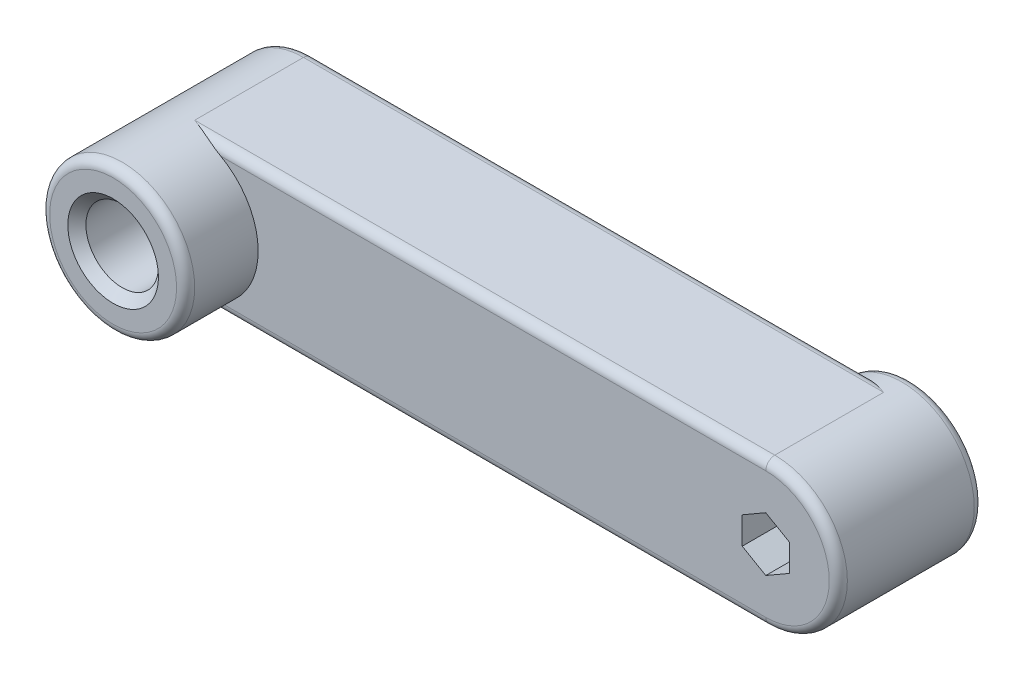
ISO-10303-21;
HEADER;
FILE_DESCRIPTION(('STEP AP214'),'2;1');
FILE_NAME('part.step','',(''),(''),'','','');
FILE_SCHEMA(('AUTOMOTIVE_DESIGN { 1 0 10303 214 1 1 1 1 }'));
ENDSEC;
DATA;
#1=APPLICATION_CONTEXT('core data for automotive mechanical design processes');
#2=APPLICATION_PROTOCOL_DEFINITION('international standard','automotive_design',2000,#1);
#3=PRODUCT_CONTEXT('',#1,'mechanical');
#4=PRODUCT('Part','Part','',(#3));
#5=PRODUCT_RELATED_PRODUCT_CATEGORY('part','',(#4));
#6=PRODUCT_DEFINITION_FORMATION('','',#4);
#7=PRODUCT_DEFINITION_CONTEXT('part definition',#1,'design');
#8=PRODUCT_DEFINITION('design','',#6,#7);
#9=PRODUCT_DEFINITION_SHAPE('','',#8);
#10=(LENGTH_UNIT() NAMED_UNIT(*) SI_UNIT(.MILLI.,.METRE.));
#11=(NAMED_UNIT(*) PLANE_ANGLE_UNIT() SI_UNIT($,.RADIAN.));
#12=(NAMED_UNIT(*) SI_UNIT($,.STERADIAN.) SOLID_ANGLE_UNIT());
#13=UNCERTAINTY_MEASURE_WITH_UNIT(LENGTH_MEASURE(1.E-05),#10,'distance_accuracy_value','');
#14=(GEOMETRIC_REPRESENTATION_CONTEXT(3) GLOBAL_UNCERTAINTY_ASSIGNED_CONTEXT((#13)) GLOBAL_UNIT_ASSIGNED_CONTEXT((#10,
#11,#12)) REPRESENTATION_CONTEXT('',''));
#15=CARTESIAN_POINT('',(0.,0.,0.));
#16=DIRECTION('',(0.,0.,1.));
#17=DIRECTION('',(1.,0.,0.));
#18=AXIS2_PLACEMENT_3D('',#15,#16,#17);
#19=CARTESIAN_POINT('',(0.,4.,12.));
#20=DIRECTION('',(0.,-1.,0.));
#21=DIRECTION('',(1.,0.,0.));
#22=AXIS2_PLACEMENT_3D('',#19,#20,#21);
#23=PLANE('',#22);
#24=DIRECTION('',(0.,0.,-1.));
#25=VECTOR('',#24,1.);
#26=CARTESIAN_POINT('',(-32.,4.,12.));
#27=LINE('',#26,#25);
#28=CARTESIAN_POINT('',(-32.,4.,7.5));
#29=VERTEX_POINT('',#28);
#30=CARTESIAN_POINT('',(-32.,4.,1.5));
#31=VERTEX_POINT('',#30);
#32=EDGE_CURVE('E183',#29,#31,#27,.T.);
#33=ORIENTED_EDGE('',*,*,#32,.F.);
#34=DIRECTION('',(-1.,0.,0.));
#35=VECTOR('',#34,1.);
#36=CARTESIAN_POINT('',(0.,4.,7.5));
#37=LINE('',#36,#35);
#38=CARTESIAN_POINT('',(0.,4.,7.5));
#39=VERTEX_POINT('',#38);
#40=EDGE_CURVE('E195',#29,#39,#37,.F.);
#41=ORIENTED_EDGE('',*,*,#40,.T.);
#42=DIRECTION('',(0.,0.,-1.));
#43=VECTOR('',#42,1.);
#44=CARTESIAN_POINT('',(0.,4.,12.));
#45=LINE('',#44,#43);
#46=CARTESIAN_POINT('',(0.,4.,1.5));
#47=VERTEX_POINT('',#46);
#48=EDGE_CURVE('E150',#39,#47,#45,.T.);
#49=ORIENTED_EDGE('',*,*,#48,.T.);
#50=DIRECTION('',(1.,0.,0.));
#51=VECTOR('',#50,1.);
#52=CARTESIAN_POINT('',(-32.,4.,1.5));
#53=LINE('',#52,#51);
#54=EDGE_CURVE('E193',#47,#31,#53,.F.);
#55=ORIENTED_EDGE('',*,*,#54,.T.);
#56=EDGE_LOOP('',(#33,#41,#49,#55));
#57=FACE_BOUND('',#56,.T.);
#58=ADVANCED_FACE('F36',(#57),#23,.F.);
#59=CARTESIAN_POINT('',(0.,-4.,12.));
#60=DIRECTION('',(0.,1.,0.));
#61=DIRECTION('',(-1.,0.,0.));
#62=AXIS2_PLACEMENT_3D('',#59,#60,#61);
#63=PLANE('',#62);
#64=DIRECTION('',(0.,0.,-1.));
#65=VECTOR('',#64,1.);
#66=CARTESIAN_POINT('',(-32.,-4.,12.));
#67=LINE('',#66,#65);
#68=CARTESIAN_POINT('',(-32.,-4.,7.5));
#69=VERTEX_POINT('',#68);
#70=CARTESIAN_POINT('',(-32.,-4.,1.5));
#71=VERTEX_POINT('',#70);
#72=EDGE_CURVE('E181',#69,#71,#67,.T.);
#73=ORIENTED_EDGE('',*,*,#72,.T.);
#74=DIRECTION('',(-1.,0.,0.));
#75=VECTOR('',#74,1.);
#76=CARTESIAN_POINT('',(0.,-4.,1.5));
#77=LINE('',#76,#75);
#78=CARTESIAN_POINT('',(0.,-4.,1.5));
#79=VERTEX_POINT('',#78);
#80=EDGE_CURVE('E210',#71,#79,#77,.F.);
#81=ORIENTED_EDGE('',*,*,#80,.T.);
#82=DIRECTION('',(0.,0.,-1.));
#83=VECTOR('',#82,1.);
#84=CARTESIAN_POINT('',(0.,-4.,12.));
#85=LINE('',#84,#83);
#86=CARTESIAN_POINT('',(0.,-4.,7.5));
#87=VERTEX_POINT('',#86);
#88=EDGE_CURVE('E178',#87,#79,#85,.T.);
#89=ORIENTED_EDGE('',*,*,#88,.F.);
#90=DIRECTION('',(1.,0.,0.));
#91=VECTOR('',#90,1.);
#92=CARTESIAN_POINT('',(-32.,-4.,7.5));
#93=LINE('',#92,#91);
#94=EDGE_CURVE('E58',#87,#69,#93,.F.);
#95=ORIENTED_EDGE('',*,*,#94,.T.);
#96=EDGE_LOOP('',(#73,#81,#89,#95));
#97=FACE_BOUND('',#96,.T.);
#98=ADVANCED_FACE('F295',(#97),#63,.F.);
#99=CARTESIAN_POINT('',(0.,0.,12.));
#100=DIRECTION('',(0.,0.,1.));
#101=DIRECTION('',(1.,0.,0.));
#102=AXIS2_PLACEMENT_3D('',#99,#100,#101);
#103=PLANE('',#102);
#104=CARTESIAN_POINT('',(-32.,0.,12.));
#105=DIRECTION('',(0.,0.,1.));
#106=DIRECTION('',(1.,0.,0.));
#107=AXIS2_PLACEMENT_3D('',#104,#105,#106);
#108=CIRCLE('',#107,2.5);
#109=CARTESIAN_POINT('',(-29.5,0.,12.));
#110=VERTEX_POINT('',#109);
#111=EDGE_CURVE('E12',#110,#110,#108,.F.);
#112=ORIENTED_EDGE('',*,*,#111,.T.);
#113=EDGE_LOOP('',(#112));
#114=FACE_BOUND('',#113,.T.);
#115=CARTESIAN_POINT('',(-32.,0.,12.));
#116=DIRECTION('',(0.,0.,1.));
#117=DIRECTION('',(1.,0.,0.));
#118=AXIS2_PLACEMENT_3D('',#115,#116,#117);
#119=CIRCLE('',#118,3.5);
#120=CARTESIAN_POINT('',(-28.5,0.,12.));
#121=VERTEX_POINT('',#120);
#122=EDGE_CURVE('E216',#121,#121,#119,.T.);
#123=ORIENTED_EDGE('',*,*,#122,.T.);
#124=EDGE_LOOP('',(#123));
#125=FACE_BOUND('',#124,.T.);
#126=ADVANCED_FACE('F300',(#114,#125),#103,.T.);
#127=CARTESIAN_POINT('',(0.,0.,12.));
#128=DIRECTION('',(0.,0.,-1.));
#129=DIRECTION('',(-1.,0.,0.));
#130=AXIS2_PLACEMENT_3D('',#127,#128,#129);
#131=CYLINDRICAL_SURFACE('',#130,4.);
#132=CARTESIAN_POINT('',(0.,0.,0.5));
#133=DIRECTION('',(0.,0.,1.));
#134=DIRECTION('',(1.,0.,0.));
#135=AXIS2_PLACEMENT_3D('',#132,#133,#134);
#136=CIRCLE('',#135,4.);
#137=CARTESIAN_POINT('',(4.,0.,0.5));
#138=VERTEX_POINT('',#137);
#139=EDGE_CURVE('E197',#138,#138,#136,.T.);
#140=ORIENTED_EDGE('',*,*,#139,.T.);
#141=EDGE_LOOP('',(#140));
#142=FACE_BOUND('',#141,.T.);
#143=ORIENTED_EDGE('',*,*,#48,.F.);
#144=CARTESIAN_POINT('',(0.,0.,7.5));
#145=DIRECTION('',(0.,0.,1.));
#146=DIRECTION('',(1.,0.,0.));
#147=AXIS2_PLACEMENT_3D('',#144,#145,#146);
#148=CIRCLE('',#147,4.);
#149=EDGE_CURVE('E200',#39,#87,#148,.F.);
#150=ORIENTED_EDGE('',*,*,#149,.T.);
#151=ORIENTED_EDGE('',*,*,#88,.T.);
#152=CARTESIAN_POINT('',(-1.93649167310371,-3.5,1.));
#153=CARTESIAN_POINT('',(-1.90753028034818,-3.51602452890695,1.0000045242322));
#154=CARTESIAN_POINT('',(-1.87837895571592,-3.5316832268583,1.0007697313531));
#155=CARTESIAN_POINT('',(-1.81976143534284,-3.56224076830084,1.00365089838944));
#156=CARTESIAN_POINT('',(-1.79029538129305,-3.57713993762364,1.00576627373734));
#157=CARTESIAN_POINT('',(-1.70161882700781,-3.62061046682219,1.01387079607546));
#158=CARTESIAN_POINT('',(-1.64199827129799,-3.64802762012,1.02161991362533));
#159=CARTESIAN_POINT('',(-1.52228181974889,-3.69957957997044,1.04073982798461));
#160=CARTESIAN_POINT('',(-1.46218931757453,-3.72372874338325,1.05209399816124));
#161=CARTESIAN_POINT('',(-1.3414130286532,-3.76892191495083,1.07767883129601));
#162=CARTESIAN_POINT('',(-1.28072883874712,-3.78996362134686,1.09191160819161));
#163=CARTESIAN_POINT('',(-1.12047898128076,-3.84127671374755,1.13234166806097));
#164=CARTESIAN_POINT('',(-1.02055733809324,-3.8689866165185,1.16041904642806));
#165=CARTESIAN_POINT('',(-0.820058124313303,-3.91639293315178,1.22056644294997));
#166=CARTESIAN_POINT('',(-0.719480299860172,-3.93608603262952,1.25263810531898));
#167=CARTESIAN_POINT('',(-0.416975407891933,-3.9834384859329,1.35260227977867));
#168=CARTESIAN_POINT('',(-0.214250558586284,-3.99937929482843,1.42425146016427));
#169=CARTESIAN_POINT('',(-0.00795031262449099,-3.99999406881035,1.49718916392494));
#170=CARTESIAN_POINT('',(-0.00397507354767996,-3.99999999403084,1.49859462398704));
#171=CARTESIAN_POINT('',(0.,-4.,1.5));
#172=B_SPLINE_CURVE_WITH_KNOTS('',3,(#152,#153,#154,#155,#156,#157,#158,#159,#160,#161,#162,
#163,#164,#165,#166,#167,#168,#169,#170,#171),.UNSPECIFIED.,.F.,.F.,(4,2,2,2,2,2,2,2,2,4),(0.,
0.0992685761729138,0.198494202244431,0.396495797958421,0.593597153212507,0.790843781091407,
1.11263751267447,1.43456414856119,2.07833236296142,2.09098148611784),.UNSPECIFIED.);
#173=CARTESIAN_POINT('',(-1.93649167310371,-3.5,1.));
#174=VERTEX_POINT('',#173);
#175=EDGE_CURVE('E229',#79,#174,#172,.F.);
#176=ORIENTED_EDGE('',*,*,#175,.T.);
#177=CARTESIAN_POINT('',(0.,0.,1.));
#178=DIRECTION('',(0.,0.,-1.));
#179=DIRECTION('',(-1.,0.,0.));
#180=AXIS2_PLACEMENT_3D('',#177,#178,#179);
#181=CIRCLE('',#180,4.);
#182=CARTESIAN_POINT('',(-1.93649167310371,3.5,1.));
#183=VERTEX_POINT('',#182);
#184=EDGE_CURVE('E334',#174,#183,#181,.T.);
#185=ORIENTED_EDGE('',*,*,#184,.T.);
#186=CARTESIAN_POINT('',(-1.93649167310371,3.5,1.));
#187=CARTESIAN_POINT('',(-1.90753028034818,3.51602452890695,1.0000045242322));
#188=CARTESIAN_POINT('',(-1.87837895571592,3.5316832268583,1.0007697313531));
#189=CARTESIAN_POINT('',(-1.81976143534284,3.56224076830083,1.00365089838944));
#190=CARTESIAN_POINT('',(-1.79029538129306,3.57713993762363,1.00576627373734));
#191=CARTESIAN_POINT('',(-1.70161882700781,3.62061046682219,1.01387079607546));
#192=CARTESIAN_POINT('',(-1.641998271298,3.64802762012,1.02161991362533));
#193=CARTESIAN_POINT('',(-1.52228181974889,3.69957957997044,1.04073982798461));
#194=CARTESIAN_POINT('',(-1.46218931757453,3.72372874338325,1.05209399816124));
#195=CARTESIAN_POINT('',(-1.3414130286532,3.76892191495083,1.07767883129601));
#196=CARTESIAN_POINT('',(-1.28072883874712,3.78996362134686,1.09191160819161));
#197=CARTESIAN_POINT('',(-1.12047898128076,3.84127671374755,1.13234166806097));
#198=CARTESIAN_POINT('',(-1.02055733809325,3.8689866165185,1.16041904642806));
#199=CARTESIAN_POINT('',(-0.820058124313303,3.91639293315178,1.22056644294997));
#200=CARTESIAN_POINT('',(-0.719480299860173,3.93608603262952,1.25263810531898));
#201=CARTESIAN_POINT('',(-0.416975407891933,3.9834384859329,1.35260227977867));
#202=CARTESIAN_POINT('',(-0.214250558586282,3.99937929482843,1.42425146016426));
#203=CARTESIAN_POINT('',(-0.00795031262449036,3.99999406881035,1.49718916392494));
#204=CARTESIAN_POINT('',(-0.00397507354767965,3.99999999403084,1.49859462398704));
#205=CARTESIAN_POINT('',(0.,4.,1.5));
#206=B_SPLINE_CURVE_WITH_KNOTS('',3,(#186,#187,#188,#189,#190,#191,#192,#193,#194,#195,#196,
#197,#198,#199,#200,#201,#202,#203,#204,#205),.UNSPECIFIED.,.F.,.F.,(4,2,2,2,2,2,2,2,2,4),(0.,
0.0992685761729134,0.19849420224443,0.39649579795842,0.593597153212507,0.790843781091407,
1.11263751267447,1.4345641485612,2.07833236296142,2.09098148611784),.UNSPECIFIED.);
#207=EDGE_CURVE('E264',#183,#47,#206,.T.);
#208=ORIENTED_EDGE('',*,*,#207,.T.);
#209=EDGE_LOOP('',(#143,#150,#151,#176,#185,#208));
#210=FACE_BOUND('',#209,.T.);
#211=ADVANCED_FACE('F247',(#142,#210),#131,.T.);
#212=CARTESIAN_POINT('',(1.29905,0.750006867190784,12.));
#213=DIRECTION('',(-0.5,-0.866025403784439,0.));
#214=DIRECTION('',(0.866025403784439,-0.5,0.));
#215=AXIS2_PLACEMENT_3D('',#212,#213,#214);
#216=PLANE('',#215);
#217=DIRECTION('',(0.,0.,-1.));
#218=VECTOR('',#217,1.);
#219=CARTESIAN_POINT('',(1.29905,0.750006867190784,12.));
#220=LINE('',#219,#218);
#221=CARTESIAN_POINT('',(1.29905,0.750006867190784,8.));
#222=VERTEX_POINT('',#221);
#223=CARTESIAN_POINT('',(1.29905,0.750006867190784,0.));
#224=VERTEX_POINT('',#223);
#225=EDGE_CURVE('E166',#222,#224,#220,.T.);
#226=ORIENTED_EDGE('',*,*,#225,.F.);
#227=DIRECTION('',(-0.866025403784439,0.5,0.));
#228=VECTOR('',#227,1.);
#229=CARTESIAN_POINT('',(1.29905,0.750006867190784,8.));
#230=LINE('',#229,#228);
#231=CARTESIAN_POINT('',(0.,1.50001373438157,8.));
#232=VERTEX_POINT('',#231);
#233=EDGE_CURVE('E145',#222,#232,#230,.T.);
#234=ORIENTED_EDGE('',*,*,#233,.T.);
#235=DIRECTION('',(0.,0.,-1.));
#236=VECTOR('',#235,1.);
#237=CARTESIAN_POINT('',(0.,1.50001373438157,12.));
#238=LINE('',#237,#236);
#239=CARTESIAN_POINT('',(0.,1.50001373438157,0.));
#240=VERTEX_POINT('',#239);
#241=EDGE_CURVE('E176',#232,#240,#238,.T.);
#242=ORIENTED_EDGE('',*,*,#241,.T.);
#243=DIRECTION('',(-0.866025403784439,0.5,0.));
#244=VECTOR('',#243,1.);
#245=CARTESIAN_POINT('',(1.29905,0.750006867190784,0.));
#246=LINE('',#245,#244);
#247=EDGE_CURVE('E339',#224,#240,#246,.T.);
#248=ORIENTED_EDGE('',*,*,#247,.F.);
#249=EDGE_LOOP('',(#226,#234,#242,#248));
#250=FACE_BOUND('',#249,.T.);
#251=ADVANCED_FACE('F388',(#250),#216,.T.);
#252=CARTESIAN_POINT('',(0.,1.50001373438157,12.));
#253=DIRECTION('',(0.5,-0.866025403784439,0.));
#254=DIRECTION('',(0.866025403784439,0.5,0.));
#255=AXIS2_PLACEMENT_3D('',#252,#253,#254);
#256=PLANE('',#255);
#257=ORIENTED_EDGE('',*,*,#241,.F.);
#258=DIRECTION('',(-0.866025403784439,-0.5,0.));
#259=VECTOR('',#258,1.);
#260=CARTESIAN_POINT('',(0.,1.50001373438157,8.));
#261=LINE('',#260,#259);
#262=CARTESIAN_POINT('',(-1.29905,0.750006867190784,8.));
#263=VERTEX_POINT('',#262);
#264=EDGE_CURVE('E356',#232,#263,#261,.T.);
#265=ORIENTED_EDGE('',*,*,#264,.T.);
#266=DIRECTION('',(0.,0.,-1.));
#267=VECTOR('',#266,1.);
#268=CARTESIAN_POINT('',(-1.29905,0.750006867190784,12.));
#269=LINE('',#268,#267);
#270=CARTESIAN_POINT('',(-1.29905,0.750006867190784,0.));
#271=VERTEX_POINT('',#270);
#272=EDGE_CURVE('E174',#263,#271,#269,.T.);
#273=ORIENTED_EDGE('',*,*,#272,.T.);
#274=DIRECTION('',(-0.866025403784439,-0.5,0.));
#275=VECTOR('',#274,1.);
#276=CARTESIAN_POINT('',(0.,1.50001373438157,0.));
#277=LINE('',#276,#275);
#278=EDGE_CURVE('E362',#240,#271,#277,.T.);
#279=ORIENTED_EDGE('',*,*,#278,.F.);
#280=EDGE_LOOP('',(#257,#265,#273,#279));
#281=FACE_BOUND('',#280,.T.);
#282=ADVANCED_FACE('F386',(#281),#256,.T.);
#283=CARTESIAN_POINT('',(-1.29905,0.750006867190784,12.));
#284=DIRECTION('',(1.,0.,0.));
#285=DIRECTION('',(0.,1.,0.));
#286=AXIS2_PLACEMENT_3D('',#283,#284,#285);
#287=PLANE('',#286);
#288=ORIENTED_EDGE('',*,*,#272,.F.);
#289=DIRECTION('',(0.,-1.,0.));
#290=VECTOR('',#289,1.);
#291=CARTESIAN_POINT('',(-1.29905,0.750006867190784,8.));
#292=LINE('',#291,#290);
#293=CARTESIAN_POINT('',(-1.29905,-0.750006867190784,8.));
#294=VERTEX_POINT('',#293);
#295=EDGE_CURVE('E353',#263,#294,#292,.T.);
#296=ORIENTED_EDGE('',*,*,#295,.T.);
#297=DIRECTION('',(0.,0.,-1.));
#298=VECTOR('',#297,1.);
#299=CARTESIAN_POINT('',(-1.29905,-0.750006867190784,12.));
#300=LINE('',#299,#298);
#301=CARTESIAN_POINT('',(-1.29905,-0.750006867190784,0.));
#302=VERTEX_POINT('',#301);
#303=EDGE_CURVE('E168',#294,#302,#300,.T.);
#304=ORIENTED_EDGE('',*,*,#303,.T.);
#305=DIRECTION('',(0.,-1.,0.));
#306=VECTOR('',#305,1.);
#307=CARTESIAN_POINT('',(-1.29905,0.750006867190784,0.));
#308=LINE('',#307,#306);
#309=EDGE_CURVE('E365',#271,#302,#308,.T.);
#310=ORIENTED_EDGE('',*,*,#309,.F.);
#311=EDGE_LOOP('',(#288,#296,#304,#310));
#312=FACE_BOUND('',#311,.T.);
#313=ADVANCED_FACE('F382',(#312),#287,.T.);
#314=CARTESIAN_POINT('',(-1.29905,-0.750006867190784,12.));
#315=DIRECTION('',(0.5,0.866025403784439,0.));
#316=DIRECTION('',(-0.866025403784439,0.5,0.));
#317=AXIS2_PLACEMENT_3D('',#314,#315,#316);
#318=PLANE('',#317);
#319=ORIENTED_EDGE('',*,*,#303,.F.);
#320=DIRECTION('',(0.866025403784439,-0.5,0.));
#321=VECTOR('',#320,1.);
#322=CARTESIAN_POINT('',(-1.29905,-0.750006867190784,8.));
#323=LINE('',#322,#321);
#324=CARTESIAN_POINT('',(0.,-1.50001373438157,8.));
#325=VERTEX_POINT('',#324);
#326=EDGE_CURVE('E159',#294,#325,#323,.T.);
#327=ORIENTED_EDGE('',*,*,#326,.T.);
#328=DIRECTION('',(0.,0.,-1.));
#329=VECTOR('',#328,1.);
#330=CARTESIAN_POINT('',(0.,-1.50001373438157,12.));
#331=LINE('',#330,#329);
#332=CARTESIAN_POINT('',(0.,-1.50001373438157,0.));
#333=VERTEX_POINT('',#332);
#334=EDGE_CURVE('E158',#325,#333,#331,.T.);
#335=ORIENTED_EDGE('',*,*,#334,.T.);
#336=DIRECTION('',(0.866025403784439,-0.5,0.));
#337=VECTOR('',#336,1.);
#338=CARTESIAN_POINT('',(-1.29905,-0.750006867190784,0.));
#339=LINE('',#338,#337);
#340=EDGE_CURVE('E368',#302,#333,#339,.T.);
#341=ORIENTED_EDGE('',*,*,#340,.F.);
#342=EDGE_LOOP('',(#319,#327,#335,#341));
#343=FACE_BOUND('',#342,.T.);
#344=ADVANCED_FACE('F379',(#343),#318,.T.);
#345=CARTESIAN_POINT('',(0.,-1.50001373438157,12.));
#346=DIRECTION('',(-0.5,0.866025403784439,0.));
#347=DIRECTION('',(-0.866025403784439,-0.5,0.));
#348=AXIS2_PLACEMENT_3D('',#345,#346,#347);
#349=PLANE('',#348);
#350=ORIENTED_EDGE('',*,*,#334,.F.);
#351=DIRECTION('',(0.866025403784439,0.5,0.));
#352=VECTOR('',#351,1.);
#353=CARTESIAN_POINT('',(0.,-1.50001373438157,8.));
#354=LINE('',#353,#352);
#355=CARTESIAN_POINT('',(1.29905,-0.750006867190783,8.));
#356=VERTEX_POINT('',#355);
#357=EDGE_CURVE('E142',#325,#356,#354,.T.);
#358=ORIENTED_EDGE('',*,*,#357,.T.);
#359=DIRECTION('',(0.,0.,-1.));
#360=VECTOR('',#359,1.);
#361=CARTESIAN_POINT('',(1.29905,-0.750006867190783,12.));
#362=LINE('',#361,#360);
#363=CARTESIAN_POINT('',(1.29905,-0.750006867190783,0.));
#364=VERTEX_POINT('',#363);
#365=EDGE_CURVE('E156',#356,#364,#362,.T.);
#366=ORIENTED_EDGE('',*,*,#365,.T.);
#367=DIRECTION('',(0.866025403784439,0.5,0.));
#368=VECTOR('',#367,1.);
#369=CARTESIAN_POINT('',(0.,-1.50001373438157,0.));
#370=LINE('',#369,#368);
#371=EDGE_CURVE('E371',#333,#364,#370,.T.);
#372=ORIENTED_EDGE('',*,*,#371,.F.);
#373=EDGE_LOOP('',(#350,#358,#366,#372));
#374=FACE_BOUND('',#373,.T.);
#375=ADVANCED_FACE('F154',(#374),#349,.T.);
#376=CARTESIAN_POINT('',(1.29905,-0.750006867190783,12.));
#377=DIRECTION('',(-1.,0.,0.));
#378=DIRECTION('',(0.,-1.,0.));
#379=AXIS2_PLACEMENT_3D('',#376,#377,#378);
#380=PLANE('',#379);
#381=ORIENTED_EDGE('',*,*,#365,.F.);
#382=DIRECTION('',(0.,1.,0.));
#383=VECTOR('',#382,1.);
#384=CARTESIAN_POINT('',(1.29905,-0.750006867190783,8.));
#385=LINE('',#384,#383);
#386=EDGE_CURVE('E138',#356,#222,#385,.T.);
#387=ORIENTED_EDGE('',*,*,#386,.T.);
#388=ORIENTED_EDGE('',*,*,#225,.T.);
#389=DIRECTION('',(0.,1.,0.));
#390=VECTOR('',#389,1.);
#391=CARTESIAN_POINT('',(1.29905,-0.750006867190783,0.));
#392=LINE('',#391,#390);
#393=EDGE_CURVE('E164',#364,#224,#392,.T.);
#394=ORIENTED_EDGE('',*,*,#393,.F.);
#395=EDGE_LOOP('',(#381,#387,#388,#394));
#396=FACE_BOUND('',#395,.T.);
#397=ADVANCED_FACE('F162',(#396),#380,.T.);
#398=CARTESIAN_POINT('',(0.,0.,0.));
#399=DIRECTION('',(0.,0.,1.));
#400=DIRECTION('',(1.,0.,0.));
#401=AXIS2_PLACEMENT_3D('',#398,#399,#400);
#402=PLANE('',#401);
#403=CARTESIAN_POINT('',(0.,0.,0.));
#404=DIRECTION('',(0.,0.,1.));
#405=DIRECTION('',(1.,0.,0.));
#406=AXIS2_PLACEMENT_3D('',#403,#404,#405);
#407=CIRCLE('',#406,3.5);
#408=CARTESIAN_POINT('',(3.5,0.,0.));
#409=VERTEX_POINT('',#408);
#410=EDGE_CURVE('E219',#409,#409,#407,.F.);
#411=ORIENTED_EDGE('',*,*,#410,.T.);
#412=EDGE_LOOP('',(#411));
#413=FACE_BOUND('',#412,.T.);
#414=ORIENTED_EDGE('',*,*,#247,.T.);
#415=ORIENTED_EDGE('',*,*,#278,.T.);
#416=ORIENTED_EDGE('',*,*,#309,.T.);
#417=ORIENTED_EDGE('',*,*,#340,.T.);
#418=ORIENTED_EDGE('',*,*,#371,.T.);
#419=ORIENTED_EDGE('',*,*,#393,.T.);
#420=EDGE_LOOP('',(#414,#415,#416,#417,#418,#419));
#421=FACE_BOUND('',#420,.T.);
#422=ADVANCED_FACE('F373',(#413,#421),#402,.F.);
#423=CARTESIAN_POINT('',(-32.,0.,12.));
#424=DIRECTION('',(0.,0.,-1.));
#425=DIRECTION('',(-1.,0.,0.));
#426=AXIS2_PLACEMENT_3D('',#423,#424,#425);
#427=CYLINDRICAL_SURFACE('',#426,4.);
#428=CARTESIAN_POINT('',(-32.,0.,11.5));
#429=DIRECTION('',(0.,0.,1.));
#430=DIRECTION('',(1.,0.,0.));
#431=AXIS2_PLACEMENT_3D('',#428,#429,#430);
#432=CIRCLE('',#431,4.);
#433=CARTESIAN_POINT('',(-28.,0.,11.5));
#434=VERTEX_POINT('',#433);
#435=EDGE_CURVE('E212',#434,#434,#432,.F.);
#436=ORIENTED_EDGE('',*,*,#435,.T.);
#437=EDGE_LOOP('',(#436));
#438=FACE_BOUND('',#437,.T.);
#439=ORIENTED_EDGE('',*,*,#32,.T.);
#440=CARTESIAN_POINT('',(-32.,0.,1.5));
#441=DIRECTION('',(0.,0.,-1.));
#442=DIRECTION('',(-1.,0.,0.));
#443=AXIS2_PLACEMENT_3D('',#440,#441,#442);
#444=CIRCLE('',#443,4.);
#445=EDGE_CURVE('E51',#31,#71,#444,.F.);
#446=ORIENTED_EDGE('',*,*,#445,.T.);
#447=ORIENTED_EDGE('',*,*,#72,.F.);
#448=CARTESIAN_POINT('',(-30.0635083268963,-3.5,8.));
#449=CARTESIAN_POINT('',(-30.0924697196518,-3.51602452890695,7.9999954757678));
#450=CARTESIAN_POINT('',(-30.1216210442841,-3.5316832268583,7.9992302686469));
#451=CARTESIAN_POINT('',(-30.1802385646572,-3.56224076830084,7.99634910161056));
#452=CARTESIAN_POINT('',(-30.2097046187069,-3.57713993762364,7.99423372626266));
#453=CARTESIAN_POINT('',(-30.2983811729922,-3.62061046682219,7.98612920392454));
#454=CARTESIAN_POINT('',(-30.358001728702,-3.64802762012,7.97838008637467));
#455=CARTESIAN_POINT('',(-30.4777181802511,-3.69957957997045,7.95926017201538));
#456=CARTESIAN_POINT('',(-30.5378106824255,-3.72372874338326,7.94790600183876));
#457=CARTESIAN_POINT('',(-30.6585869713468,-3.76892191495084,7.92232116870399));
#458=CARTESIAN_POINT('',(-30.7192711612529,-3.78996362134687,7.90808839180839));
#459=CARTESIAN_POINT('',(-30.8795210187192,-3.84127671374756,7.86765833193903));
#460=CARTESIAN_POINT('',(-30.9794426619068,-3.8689866165185,7.83958095357194));
#461=CARTESIAN_POINT('',(-31.1799418756867,-3.91639293315178,7.77943355705003));
#462=CARTESIAN_POINT('',(-31.2805197001398,-3.93608603262952,7.74736189468103));
#463=CARTESIAN_POINT('',(-31.5830245921081,-3.9834384859329,7.64739772022134));
#464=CARTESIAN_POINT('',(-31.7857494414137,-3.99937929482844,7.57574853983574));
#465=CARTESIAN_POINT('',(-31.9920496873755,-3.99999406881035,7.50281083607506));
#466=CARTESIAN_POINT('',(-31.9960249264523,-3.99999999403084,7.50140537601296));
#467=CARTESIAN_POINT('',(-32.,-4.,7.5));
#468=B_SPLINE_CURVE_WITH_KNOTS('',3,(#448,#449,#450,#451,#452,#453,#454,#455,#456,#457,#458,
#459,#460,#461,#462,#463,#464,#465,#466,#467),.UNSPECIFIED.,.F.,.F.,(4,2,2,2,2,2,2,2,2,4),(0.,
0.0992685761729107,0.198494202244431,0.396495797958425,0.593597153212513,0.790843781091416,
1.11263751267448,1.43456414856119,2.07833236296142,2.09098148611785),.UNSPECIFIED.);
#469=CARTESIAN_POINT('',(-30.0635083268963,-3.5,8.));
#470=VERTEX_POINT('',#469);
#471=EDGE_CURVE('E259',#69,#470,#468,.F.);
#472=ORIENTED_EDGE('',*,*,#471,.T.);
#473=CARTESIAN_POINT('',(-32.,0.,8.));
#474=DIRECTION('',(0.,0.,1.));
#475=DIRECTION('',(1.,0.,0.));
#476=AXIS2_PLACEMENT_3D('',#473,#474,#475);
#477=CIRCLE('',#476,4.);
#478=CARTESIAN_POINT('',(-30.0635083268963,3.5,8.));
#479=VERTEX_POINT('',#478);
#480=EDGE_CURVE('E160',#470,#479,#477,.T.);
#481=ORIENTED_EDGE('',*,*,#480,.T.);
#482=CARTESIAN_POINT('',(-30.0635083268963,3.5,8.));
#483=CARTESIAN_POINT('',(-30.0924697196518,3.51602452890694,7.9999954757678));
#484=CARTESIAN_POINT('',(-30.1216210442841,3.53168322685829,7.9992302686469));
#485=CARTESIAN_POINT('',(-30.1802385646572,3.56224076830083,7.99634910161056));
#486=CARTESIAN_POINT('',(-30.2097046187069,3.57713993762363,7.99423372626266));
#487=CARTESIAN_POINT('',(-30.2983811729922,3.62061046682219,7.98612920392454));
#488=CARTESIAN_POINT('',(-30.358001728702,3.64802762011999,7.97838008637467));
#489=CARTESIAN_POINT('',(-30.4777181802511,3.69957957997044,7.95926017201539));
#490=CARTESIAN_POINT('',(-30.5378106824255,3.72372874338325,7.94790600183876));
#491=CARTESIAN_POINT('',(-30.6585869713468,3.76892191495083,7.92232116870399));
#492=CARTESIAN_POINT('',(-30.7192711612529,3.78996362134686,7.90808839180839));
#493=CARTESIAN_POINT('',(-30.8795210187192,3.84127671374755,7.86765833193903));
#494=CARTESIAN_POINT('',(-30.9794426619068,3.8689866165185,7.83958095357194));
#495=CARTESIAN_POINT('',(-31.1799418756867,3.91639293315178,7.77943355705003));
#496=CARTESIAN_POINT('',(-31.2805197001398,3.93608603262952,7.74736189468103));
#497=CARTESIAN_POINT('',(-31.5830245921081,3.98343848593289,7.64739772022134));
#498=CARTESIAN_POINT('',(-31.7857494414137,3.99937929482843,7.57574853983574));
#499=CARTESIAN_POINT('',(-31.9920496873755,3.99999406881034,7.50281083607506));
#500=CARTESIAN_POINT('',(-31.9960249264523,3.99999999403083,7.50140537601296));
#501=CARTESIAN_POINT('',(-32.,4.,7.5));
#502=B_SPLINE_CURVE_WITH_KNOTS('',3,(#482,#483,#484,#485,#486,#487,#488,#489,#490,#491,#492,
#493,#494,#495,#496,#497,#498,#499,#500,#501),.UNSPECIFIED.,.F.,.F.,(4,2,2,2,2,2,2,2,2,4),(0.,
0.0992685761729143,0.198494202244431,0.396495797958425,0.593597153212513,0.790843781091415,
1.11263751267448,1.43456414856119,2.07833236296142,2.09098148611785),.UNSPECIFIED.);
#503=EDGE_CURVE('E222',#479,#29,#502,.T.);
#504=ORIENTED_EDGE('',*,*,#503,.T.);
#505=EDGE_LOOP('',(#439,#446,#447,#472,#481,#504));
#506=FACE_BOUND('',#505,.T.);
#507=ADVANCED_FACE('F236',(#438,#506),#427,.T.);
#508=CARTESIAN_POINT('',(-32.,0.,12.));
#509=DIRECTION('',(0.,0.,-1.));
#510=DIRECTION('',(-1.,0.,0.));
#511=AXIS2_PLACEMENT_3D('',#508,#509,#510);
#512=CYLINDRICAL_SURFACE('',#511,2.);
#513=CARTESIAN_POINT('',(-32.,0.,1.50000000000001));
#514=DIRECTION('',(0.,0.,-1.));
#515=DIRECTION('',(-1.,0.,0.));
#516=AXIS2_PLACEMENT_3D('',#513,#514,#515);
#517=CIRCLE('',#516,2.);
#518=CARTESIAN_POINT('',(-34.,0.,1.50000000000001));
#519=VERTEX_POINT('',#518);
#520=EDGE_CURVE('E323',#519,#519,#517,.T.);
#521=ORIENTED_EDGE('',*,*,#520,.T.);
#522=EDGE_LOOP('',(#521));
#523=FACE_BOUND('',#522,.T.);
#524=CARTESIAN_POINT('',(-32.,0.,11.5));
#525=DIRECTION('',(0.,0.,1.));
#526=DIRECTION('',(1.,0.,0.));
#527=AXIS2_PLACEMENT_3D('',#524,#525,#526);
#528=CIRCLE('',#527,2.);
#529=CARTESIAN_POINT('',(-30.,0.,11.5));
#530=VERTEX_POINT('',#529);
#531=EDGE_CURVE('E270',#530,#530,#528,.T.);
#532=ORIENTED_EDGE('',*,*,#531,.T.);
#533=EDGE_LOOP('',(#532));
#534=FACE_BOUND('',#533,.T.);
#535=ADVANCED_FACE('F330',(#523,#534),#512,.F.);
#536=CARTESIAN_POINT('',(-16.,0.,1.));
#537=DIRECTION('',(0.,0.,-1.));
#538=DIRECTION('',(-1.,0.,0.));
#539=AXIS2_PLACEMENT_3D('',#536,#537,#538);
#540=PLANE('',#539);
#541=CARTESIAN_POINT('',(-32.,0.,1.));
#542=DIRECTION('',(0.,0.,-1.));
#543=DIRECTION('',(-1.,0.,0.));
#544=AXIS2_PLACEMENT_3D('',#541,#542,#543);
#545=CIRCLE('',#544,2.50000000000001);
#546=CARTESIAN_POINT('',(-34.5,0.,1.));
#547=VERTEX_POINT('',#546);
#548=EDGE_CURVE('E44',#547,#547,#545,.F.);
#549=ORIENTED_EDGE('',*,*,#548,.T.);
#550=EDGE_LOOP('',(#549));
#551=FACE_BOUND('',#550,.T.);
#552=ORIENTED_EDGE('',*,*,#184,.F.);
#553=DIRECTION('',(-1.,0.,0.));
#554=VECTOR('',#553,1.);
#555=CARTESIAN_POINT('',(-32.,-3.5,1.));
#556=LINE('',#555,#554);
#557=CARTESIAN_POINT('',(-32.,-3.5,1.));
#558=VERTEX_POINT('',#557);
#559=EDGE_CURVE('E206',#174,#558,#556,.T.);
#560=ORIENTED_EDGE('',*,*,#559,.T.);
#561=CARTESIAN_POINT('',(-32.,0.,1.));
#562=DIRECTION('',(0.,0.,-1.));
#563=DIRECTION('',(-1.,0.,0.));
#564=AXIS2_PLACEMENT_3D('',#561,#562,#563);
#565=CIRCLE('',#564,3.5);
#566=CARTESIAN_POINT('',(-32.,3.5,1.));
#567=VERTEX_POINT('',#566);
#568=EDGE_CURVE('E204',#558,#567,#565,.T.);
#569=ORIENTED_EDGE('',*,*,#568,.T.);
#570=DIRECTION('',(1.,0.,0.));
#571=VECTOR('',#570,1.);
#572=CARTESIAN_POINT('',(0.,3.5,1.));
#573=LINE('',#572,#571);
#574=EDGE_CURVE('E202',#567,#183,#573,.T.);
#575=ORIENTED_EDGE('',*,*,#574,.T.);
#576=EDGE_LOOP('',(#552,#560,#569,#575));
#577=FACE_BOUND('',#576,.T.);
#578=ADVANCED_FACE('F327',(#551,#577),#540,.T.);
#579=CARTESIAN_POINT('',(-16.,0.,8.));
#580=DIRECTION('',(0.,0.,1.));
#581=DIRECTION('',(1.,0.,0.));
#582=AXIS2_PLACEMENT_3D('',#579,#580,#581);
#583=PLANE('',#582);
#584=ORIENTED_EDGE('',*,*,#386,.F.);
#585=ORIENTED_EDGE('',*,*,#357,.F.);
#586=ORIENTED_EDGE('',*,*,#326,.F.);
#587=ORIENTED_EDGE('',*,*,#295,.F.);
#588=ORIENTED_EDGE('',*,*,#264,.F.);
#589=ORIENTED_EDGE('',*,*,#233,.F.);
#590=EDGE_LOOP('',(#584,#585,#586,#587,#588,#589));
#591=FACE_BOUND('',#590,.T.);
#592=CARTESIAN_POINT('',(0.,0.,8.));
#593=DIRECTION('',(0.,0.,1.));
#594=DIRECTION('',(1.,0.,0.));
#595=AXIS2_PLACEMENT_3D('',#592,#593,#594);
#596=CIRCLE('',#595,3.5);
#597=CARTESIAN_POINT('',(0.,-3.5,8.));
#598=VERTEX_POINT('',#597);
#599=CARTESIAN_POINT('',(0.,3.5,8.));
#600=VERTEX_POINT('',#599);
#601=EDGE_CURVE('E188',#598,#600,#596,.T.);
#602=ORIENTED_EDGE('',*,*,#601,.T.);
#603=DIRECTION('',(-1.,0.,0.));
#604=VECTOR('',#603,1.);
#605=CARTESIAN_POINT('',(-32.,3.5,8.));
#606=LINE('',#605,#604);
#607=EDGE_CURVE('E190',#600,#479,#606,.T.);
#608=ORIENTED_EDGE('',*,*,#607,.T.);
#609=ORIENTED_EDGE('',*,*,#480,.F.);
#610=DIRECTION('',(1.,0.,0.));
#611=VECTOR('',#610,1.);
#612=CARTESIAN_POINT('',(0.,-3.5,8.));
#613=LINE('',#612,#611);
#614=EDGE_CURVE('E149',#470,#598,#613,.T.);
#615=ORIENTED_EDGE('',*,*,#614,.T.);
#616=EDGE_LOOP('',(#602,#608,#609,#615));
#617=FACE_BOUND('',#616,.T.);
#618=ADVANCED_FACE('F140',(#591,#617),#583,.T.);
#619=CARTESIAN_POINT('',(-16.,-3.5,7.5));
#620=DIRECTION('',(-1.,0.,0.));
#621=DIRECTION('',(0.,-1.,0.));
#622=AXIS2_PLACEMENT_3D('',#619,#620,#621);
#623=CYLINDRICAL_SURFACE('',#622,0.5);
#624=ORIENTED_EDGE('',*,*,#471,.F.);
#625=ORIENTED_EDGE('',*,*,#94,.F.);
#626=CARTESIAN_POINT('',(0.,-3.5,7.5));
#627=DIRECTION('',(1.,0.,0.));
#628=DIRECTION('',(0.,1.,0.));
#629=AXIS2_PLACEMENT_3D('',#626,#627,#628);
#630=CIRCLE('',#629,0.5);
#631=EDGE_CURVE('E311',#598,#87,#630,.T.);
#632=ORIENTED_EDGE('',*,*,#631,.F.);
#633=ORIENTED_EDGE('',*,*,#614,.F.);
#634=EDGE_LOOP('',(#624,#625,#632,#633));
#635=FACE_BOUND('',#634,.T.);
#636=ADVANCED_FACE('F251',(#635),#623,.T.);
#637=CARTESIAN_POINT('',(0.,0.,7.5));
#638=DIRECTION('',(0.,0.,1.));
#639=DIRECTION('',(1.,0.,0.));
#640=AXIS2_PLACEMENT_3D('',#637,#638,#639);
#641=TOROIDAL_SURFACE('',#640,3.5,0.5);
#642=ORIENTED_EDGE('',*,*,#631,.T.);
#643=ORIENTED_EDGE('',*,*,#149,.F.);
#644=CARTESIAN_POINT('',(0.,3.5,7.5));
#645=DIRECTION('',(-1.,0.,0.));
#646=DIRECTION('',(0.,-1.,0.));
#647=AXIS2_PLACEMENT_3D('',#644,#645,#646);
#648=CIRCLE('',#647,0.5);
#649=EDGE_CURVE('E271',#600,#39,#648,.T.);
#650=ORIENTED_EDGE('',*,*,#649,.F.);
#651=ORIENTED_EDGE('',*,*,#601,.F.);
#652=EDGE_LOOP('',(#642,#643,#650,#651));
#653=FACE_BOUND('',#652,.T.);
#654=ADVANCED_FACE('F245',(#653),#641,.T.);
#655=CARTESIAN_POINT('',(-16.,3.5,7.5));
#656=DIRECTION('',(1.,0.,0.));
#657=DIRECTION('',(0.,1.,0.));
#658=AXIS2_PLACEMENT_3D('',#655,#656,#657);
#659=CYLINDRICAL_SURFACE('',#658,0.5);
#660=ORIENTED_EDGE('',*,*,#649,.T.);
#661=ORIENTED_EDGE('',*,*,#40,.F.);
#662=ORIENTED_EDGE('',*,*,#503,.F.);
#663=ORIENTED_EDGE('',*,*,#607,.F.);
#664=EDGE_LOOP('',(#660,#661,#662,#663));
#665=FACE_BOUND('',#664,.T.);
#666=ADVANCED_FACE('F240',(#665),#659,.T.);
#667=CARTESIAN_POINT('',(-16.,3.5,1.5));
#668=DIRECTION('',(-1.,0.,0.));
#669=DIRECTION('',(0.,-1.,0.));
#670=AXIS2_PLACEMENT_3D('',#667,#668,#669);
#671=CYLINDRICAL_SURFACE('',#670,0.5);
#672=ORIENTED_EDGE('',*,*,#207,.F.);
#673=ORIENTED_EDGE('',*,*,#574,.F.);
#674=CARTESIAN_POINT('',(-32.,3.5,1.5));
#675=DIRECTION('',(-1.,0.,0.));
#676=DIRECTION('',(0.,0.,1.));
#677=AXIS2_PLACEMENT_3D('',#674,#675,#676);
#678=CIRCLE('',#677,0.5);
#679=EDGE_CURVE('E312',#31,#567,#678,.T.);
#680=ORIENTED_EDGE('',*,*,#679,.F.);
#681=ORIENTED_EDGE('',*,*,#54,.F.);
#682=EDGE_LOOP('',(#672,#673,#680,#681));
#683=FACE_BOUND('',#682,.T.);
#684=ADVANCED_FACE('F244',(#683),#671,.T.);
#685=CARTESIAN_POINT('',(-32.,0.,1.5));
#686=DIRECTION('',(0.,0.,-1.));
#687=DIRECTION('',(-1.,0.,0.));
#688=AXIS2_PLACEMENT_3D('',#685,#686,#687);
#689=TOROIDAL_SURFACE('',#688,3.5,0.5);
#690=ORIENTED_EDGE('',*,*,#679,.T.);
#691=ORIENTED_EDGE('',*,*,#568,.F.);
#692=CARTESIAN_POINT('',(-32.,-3.5,1.5));
#693=DIRECTION('',(1.,0.,0.));
#694=DIRECTION('',(0.,0.,-1.));
#695=AXIS2_PLACEMENT_3D('',#692,#693,#694);
#696=CIRCLE('',#695,0.5);
#697=EDGE_CURVE('E315',#71,#558,#696,.T.);
#698=ORIENTED_EDGE('',*,*,#697,.F.);
#699=ORIENTED_EDGE('',*,*,#445,.F.);
#700=EDGE_LOOP('',(#690,#691,#698,#699));
#701=FACE_BOUND('',#700,.T.);
#702=ADVANCED_FACE('F276',(#701),#689,.T.);
#703=CARTESIAN_POINT('',(-16.,-3.5,1.5));
#704=DIRECTION('',(1.,0.,0.));
#705=DIRECTION('',(0.,1.,0.));
#706=AXIS2_PLACEMENT_3D('',#703,#704,#705);
#707=CYLINDRICAL_SURFACE('',#706,0.5);
#708=ORIENTED_EDGE('',*,*,#175,.F.);
#709=ORIENTED_EDGE('',*,*,#80,.F.);
#710=ORIENTED_EDGE('',*,*,#697,.T.);
#711=ORIENTED_EDGE('',*,*,#559,.F.);
#712=EDGE_LOOP('',(#708,#709,#710,#711));
#713=FACE_BOUND('',#712,.T.);
#714=ADVANCED_FACE('F256',(#713),#707,.T.);
#715=CARTESIAN_POINT('',(-32.,0.,11.5));
#716=DIRECTION('',(0.,0.,1.));
#717=DIRECTION('',(1.,0.,0.));
#718=AXIS2_PLACEMENT_3D('',#715,#716,#717);
#719=TOROIDAL_SURFACE('',#718,3.5,0.5);
#720=ORIENTED_EDGE('',*,*,#435,.F.);
#721=EDGE_LOOP('',(#720));
#722=FACE_BOUND('',#721,.T.);
#723=ORIENTED_EDGE('',*,*,#122,.F.);
#724=EDGE_LOOP('',(#723));
#725=FACE_BOUND('',#724,.T.);
#726=ADVANCED_FACE('F278',(#722,#725),#719,.T.);
#727=CARTESIAN_POINT('',(0.,0.,0.5));
#728=DIRECTION('',(0.,0.,1.));
#729=DIRECTION('',(1.,0.,0.));
#730=AXIS2_PLACEMENT_3D('',#727,#728,#729);
#731=TOROIDAL_SURFACE('',#730,3.5,0.5);
#732=ORIENTED_EDGE('',*,*,#410,.F.);
#733=EDGE_LOOP('',(#732));
#734=FACE_BOUND('',#733,.T.);
#735=ORIENTED_EDGE('',*,*,#139,.F.);
#736=EDGE_LOOP('',(#735));
#737=FACE_BOUND('',#736,.T.);
#738=ADVANCED_FACE('F281',(#734,#737),#731,.T.);
#739=CARTESIAN_POINT('',(-32.,0.,1.50000000000001));
#740=DIRECTION('',(0.,0.,-1.));
#741=DIRECTION('',(-1.,0.,0.));
#742=AXIS2_PLACEMENT_3D('',#739,#740,#741);
#743=CONICAL_SURFACE('',#742,2.,0.785398163397445);
#744=ORIENTED_EDGE('',*,*,#548,.F.);
#745=EDGE_LOOP('',(#744));
#746=FACE_BOUND('',#745,.T.);
#747=ORIENTED_EDGE('',*,*,#520,.F.);
#748=EDGE_LOOP('',(#747));
#749=FACE_BOUND('',#748,.T.);
#750=ADVANCED_FACE('F284',(#746,#749),#743,.F.);
#751=CARTESIAN_POINT('',(-32.,0.,11.5));
#752=DIRECTION('',(0.,0.,1.));
#753=DIRECTION('',(1.,0.,0.));
#754=AXIS2_PLACEMENT_3D('',#751,#752,#753);
#755=CONICAL_SURFACE('',#754,2.,0.785398163397445);
#756=ORIENTED_EDGE('',*,*,#111,.F.);
#757=EDGE_LOOP('',(#756));
#758=FACE_BOUND('',#757,.T.);
#759=ORIENTED_EDGE('',*,*,#531,.F.);
#760=EDGE_LOOP('',(#759));
#761=FACE_BOUND('',#760,.T.);
#762=ADVANCED_FACE('F38',(#758,#761),#755,.F.);
#763=CLOSED_SHELL('',(#58,#98,#126,#211,#251,#282,#313,#344,#375,#397,#422,#507,#535,#578,#618,
#636,#654,#666,#684,#702,#714,#726,#738,#750,#762));
#764=MANIFOLD_SOLID_BREP('B2',#763);
#765=ADVANCED_BREP_SHAPE_REPRESENTATION('',(#18,#764),#14);
#766=SHAPE_DEFINITION_REPRESENTATION(#9,#765);
ENDSEC;
END-ISO-10303-21;
